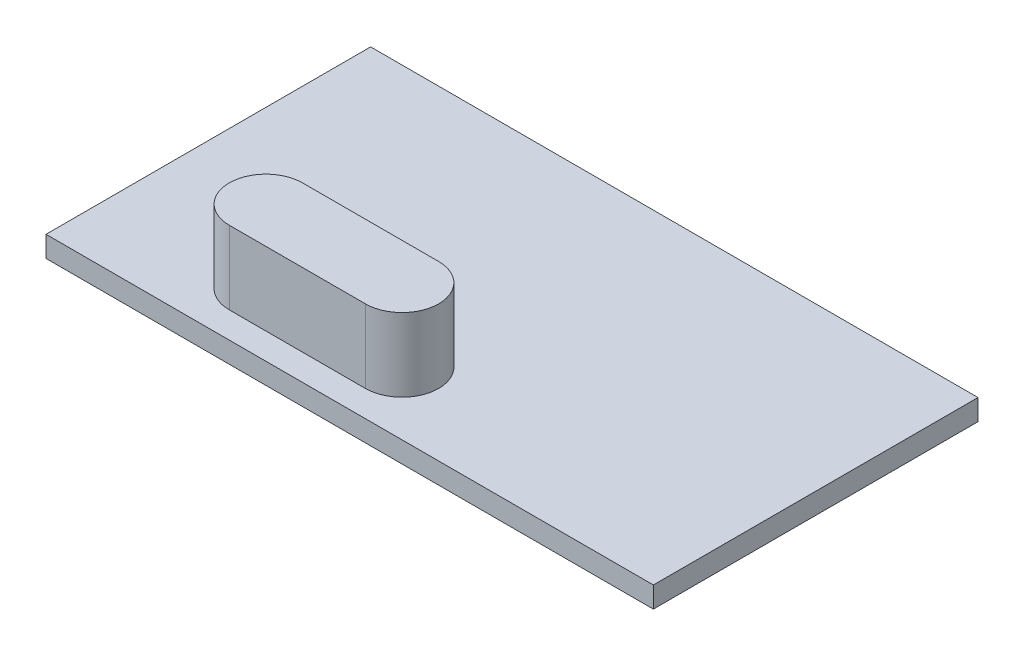
ISO-10303-21;
HEADER;
FILE_DESCRIPTION(('STEP AP214'),'2;1');
FILE_NAME('part.step','',(''),(''),'','','');
FILE_SCHEMA(('AUTOMOTIVE_DESIGN { 1 0 10303 214 1 1 1 1 }'));
ENDSEC;
DATA;
#1=APPLICATION_CONTEXT('core data for automotive mechanical design processes');
#2=APPLICATION_PROTOCOL_DEFINITION('international standard','automotive_design',2000,#1);
#3=PRODUCT_CONTEXT('',#1,'mechanical');
#4=PRODUCT('Part','Part','',(#3));
#5=PRODUCT_RELATED_PRODUCT_CATEGORY('part','',(#4));
#6=PRODUCT_DEFINITION_FORMATION('','',#4);
#7=PRODUCT_DEFINITION_CONTEXT('part definition',#1,'design');
#8=PRODUCT_DEFINITION('design','',#6,#7);
#9=PRODUCT_DEFINITION_SHAPE('','',#8);
#10=(LENGTH_UNIT() NAMED_UNIT(*) SI_UNIT(.MILLI.,.METRE.));
#11=(NAMED_UNIT(*) PLANE_ANGLE_UNIT() SI_UNIT($,.RADIAN.));
#12=(NAMED_UNIT(*) SI_UNIT($,.STERADIAN.) SOLID_ANGLE_UNIT());
#13=UNCERTAINTY_MEASURE_WITH_UNIT(LENGTH_MEASURE(1.E-05),#10,'distance_accuracy_value','');
#14=(GEOMETRIC_REPRESENTATION_CONTEXT(3) GLOBAL_UNCERTAINTY_ASSIGNED_CONTEXT((#13)) GLOBAL_UNIT_ASSIGNED_CONTEXT((#10,
#11,#12)) REPRESENTATION_CONTEXT('',''));
#15=CARTESIAN_POINT('',(0.,0.,0.));
#16=DIRECTION('',(0.,0.,1.));
#17=DIRECTION('',(1.,0.,0.));
#18=AXIS2_PLACEMENT_3D('',#15,#16,#17);
#19=CARTESIAN_POINT('',(0.,0.,0.));
#20=DIRECTION('',(0.,-1.,0.));
#21=DIRECTION('',(0.,0.,-1.));
#22=AXIS2_PLACEMENT_3D('',#19,#20,#21);
#23=PLANE('',#22);
#24=DIRECTION('',(0.,0.,-1.));
#25=VECTOR('',#24,1.);
#26=CARTESIAN_POINT('',(14.5,0.,7.75));
#27=LINE('',#26,#25);
#28=CARTESIAN_POINT('',(14.5,0.,7.75));
#29=VERTEX_POINT('',#28);
#30=CARTESIAN_POINT('',(14.5,0.,-7.75));
#31=VERTEX_POINT('',#30);
#32=EDGE_CURVE('E204',#29,#31,#27,.T.);
#33=ORIENTED_EDGE('',*,*,#32,.F.);
#34=DIRECTION('',(1.,0.,0.));
#35=VECTOR('',#34,1.);
#36=CARTESIAN_POINT('',(-14.5,0.,7.75));
#37=LINE('',#36,#35);
#38=CARTESIAN_POINT('',(-14.5,0.,7.75));
#39=VERTEX_POINT('',#38);
#40=EDGE_CURVE('E210',#39,#29,#37,.T.);
#41=ORIENTED_EDGE('',*,*,#40,.F.);
#42=DIRECTION('',(0.,0.,1.));
#43=VECTOR('',#42,1.);
#44=CARTESIAN_POINT('',(-14.5,0.,7.75));
#45=LINE('',#44,#43);
#46=CARTESIAN_POINT('',(-14.5,0.,-7.75));
#47=VERTEX_POINT('',#46);
#48=EDGE_CURVE('E226',#47,#39,#45,.T.);
#49=ORIENTED_EDGE('',*,*,#48,.F.);
#50=DIRECTION('',(-1.,0.,0.));
#51=VECTOR('',#50,1.);
#52=CARTESIAN_POINT('',(-14.5,0.,-7.75));
#53=LINE('',#52,#51);
#54=EDGE_CURVE('E223',#31,#47,#53,.T.);
#55=ORIENTED_EDGE('',*,*,#54,.F.);
#56=EDGE_LOOP('',(#33,#41,#49,#55));
#57=FACE_BOUND('',#56,.T.);
#58=DIRECTION('',(1.,0.,0.));
#59=VECTOR('',#58,1.);
#60=CARTESIAN_POINT('',(-14.3,0.,-7.25));
#61=LINE('',#60,#59);
#62=CARTESIAN_POINT('',(-14.3,0.,-7.25));
#63=VERTEX_POINT('',#62);
#64=CARTESIAN_POINT('',(-9.3,0.,-7.25));
#65=VERTEX_POINT('',#64);
#66=EDGE_CURVE('E407',#63,#65,#61,.T.);
#67=ORIENTED_EDGE('',*,*,#66,.F.);
#68=DIRECTION('',(0.,0.,-1.));
#69=VECTOR('',#68,1.);
#70=CARTESIAN_POINT('',(-14.3,0.,2.75));
#71=LINE('',#70,#69);
#72=CARTESIAN_POINT('',(-14.3,0.,2.75));
#73=VERTEX_POINT('',#72);
#74=EDGE_CURVE('E154',#73,#63,#71,.T.);
#75=ORIENTED_EDGE('',*,*,#74,.F.);
#76=DIRECTION('',(-1.,0.,0.));
#77=VECTOR('',#76,1.);
#78=CARTESIAN_POINT('',(-14.3,0.,2.75));
#79=LINE('',#78,#77);
#80=CARTESIAN_POINT('',(-9.3,0.,2.75));
#81=VERTEX_POINT('',#80);
#82=EDGE_CURVE('E150',#81,#73,#79,.T.);
#83=ORIENTED_EDGE('',*,*,#82,.F.);
#84=DIRECTION('',(0.,0.,1.));
#85=VECTOR('',#84,1.);
#86=CARTESIAN_POINT('',(-9.3,0.,2.75));
#87=LINE('',#86,#85);
#88=EDGE_CURVE('E403',#65,#81,#87,.T.);
#89=ORIENTED_EDGE('',*,*,#88,.F.);
#90=EDGE_LOOP('',(#67,#75,#83,#89));
#91=FACE_BOUND('',#90,.T.);
#92=ADVANCED_FACE('F39',(#57,#91),#23,.T.);
#93=CARTESIAN_POINT('',(0.,1.,0.));
#94=DIRECTION('',(0.,-1.,0.));
#95=DIRECTION('',(0.,0.,-1.));
#96=AXIS2_PLACEMENT_3D('',#93,#94,#95);
#97=PLANE('',#96);
#98=DIRECTION('',(0.,0.,-1.));
#99=VECTOR('',#98,1.);
#100=CARTESIAN_POINT('',(14.5,1.,7.75));
#101=LINE('',#100,#99);
#102=CARTESIAN_POINT('',(14.5,1.,7.75));
#103=VERTEX_POINT('',#102);
#104=CARTESIAN_POINT('',(14.5,1.,-7.75));
#105=VERTEX_POINT('',#104);
#106=EDGE_CURVE('E205',#103,#105,#101,.T.);
#107=ORIENTED_EDGE('',*,*,#106,.T.);
#108=DIRECTION('',(-1.,0.,0.));
#109=VECTOR('',#108,1.);
#110=CARTESIAN_POINT('',(-14.5,1.,-7.75));
#111=LINE('',#110,#109);
#112=CARTESIAN_POINT('',(-14.5,1.,-7.75));
#113=VERTEX_POINT('',#112);
#114=EDGE_CURVE('E209',#105,#113,#111,.T.);
#115=ORIENTED_EDGE('',*,*,#114,.T.);
#116=DIRECTION('',(0.,0.,1.));
#117=VECTOR('',#116,1.);
#118=CARTESIAN_POINT('',(-14.5,1.,7.75));
#119=LINE('',#118,#117);
#120=CARTESIAN_POINT('',(-14.5,1.,7.75));
#121=VERTEX_POINT('',#120);
#122=EDGE_CURVE('E213',#113,#121,#119,.T.);
#123=ORIENTED_EDGE('',*,*,#122,.T.);
#124=DIRECTION('',(1.,0.,0.));
#125=VECTOR('',#124,1.);
#126=CARTESIAN_POINT('',(-14.5,1.,7.75));
#127=LINE('',#126,#125);
#128=EDGE_CURVE('E216',#121,#103,#127,.T.);
#129=ORIENTED_EDGE('',*,*,#128,.T.);
#130=EDGE_LOOP('',(#107,#115,#123,#129));
#131=FACE_BOUND('',#130,.T.);
#132=CARTESIAN_POINT('',(-7.,1.,4.75));
#133=DIRECTION('',(0.,1.,0.));
#134=DIRECTION('',(0.,0.,1.));
#135=AXIS2_PLACEMENT_3D('',#132,#133,#134);
#136=CIRCLE('',#135,1.75);
#137=CARTESIAN_POINT('',(-7.,1.,3.));
#138=VERTEX_POINT('',#137);
#139=CARTESIAN_POINT('',(-7.,1.,6.5));
#140=VERTEX_POINT('',#139);
#141=EDGE_CURVE('E157',#138,#140,#136,.T.);
#142=ORIENTED_EDGE('',*,*,#141,.F.);
#143=DIRECTION('',(-1.,0.,0.));
#144=VECTOR('',#143,1.);
#145=CARTESIAN_POINT('',(-7.,1.,3.));
#146=LINE('',#145,#144);
#147=CARTESIAN_POINT('',(-0.500000000000005,1.,3.));
#148=VERTEX_POINT('',#147);
#149=EDGE_CURVE('E171',#148,#138,#146,.T.);
#150=ORIENTED_EDGE('',*,*,#149,.F.);
#151=CARTESIAN_POINT('',(-0.500000000000005,1.,4.75));
#152=DIRECTION('',(0.,1.,0.));
#153=DIRECTION('',(0.,0.,1.));
#154=AXIS2_PLACEMENT_3D('',#151,#152,#153);
#155=CIRCLE('',#154,1.75);
#156=CARTESIAN_POINT('',(-0.500000000000005,1.,6.5));
#157=VERTEX_POINT('',#156);
#158=EDGE_CURVE('E183',#157,#148,#155,.T.);
#159=ORIENTED_EDGE('',*,*,#158,.F.);
#160=DIRECTION('',(1.,0.,0.));
#161=VECTOR('',#160,1.);
#162=CARTESIAN_POINT('',(-7.,1.,6.5));
#163=LINE('',#162,#161);
#164=EDGE_CURVE('E63',#140,#157,#163,.T.);
#165=ORIENTED_EDGE('',*,*,#164,.F.);
#166=EDGE_LOOP('',(#142,#150,#159,#165));
#167=FACE_BOUND('',#166,.T.);
#168=ADVANCED_FACE('F258',(#131,#167),#97,.F.);
#169=CARTESIAN_POINT('',(14.5,1.,7.75));
#170=DIRECTION('',(-1.,0.,0.));
#171=DIRECTION('',(0.,0.,1.));
#172=AXIS2_PLACEMENT_3D('',#169,#170,#171);
#173=PLANE('',#172);
#174=ORIENTED_EDGE('',*,*,#32,.T.);
#175=DIRECTION('',(0.,-1.,0.));
#176=VECTOR('',#175,1.);
#177=CARTESIAN_POINT('',(14.5,1.,-7.75));
#178=LINE('',#177,#176);
#179=EDGE_CURVE('E11',#105,#31,#178,.T.);
#180=ORIENTED_EDGE('',*,*,#179,.F.);
#181=ORIENTED_EDGE('',*,*,#106,.F.);
#182=DIRECTION('',(0.,-1.,0.));
#183=VECTOR('',#182,1.);
#184=CARTESIAN_POINT('',(14.5,1.,7.75));
#185=LINE('',#184,#183);
#186=EDGE_CURVE('E219',#103,#29,#185,.T.);
#187=ORIENTED_EDGE('',*,*,#186,.T.);
#188=EDGE_LOOP('',(#174,#180,#181,#187));
#189=FACE_BOUND('',#188,.T.);
#190=ADVANCED_FACE('F41',(#189),#173,.F.);
#191=CARTESIAN_POINT('',(-14.5,1.,-7.75));
#192=DIRECTION('',(0.,0.,1.));
#193=DIRECTION('',(1.,0.,0.));
#194=AXIS2_PLACEMENT_3D('',#191,#192,#193);
#195=PLANE('',#194);
#196=ORIENTED_EDGE('',*,*,#54,.T.);
#197=DIRECTION('',(0.,-1.,0.));
#198=VECTOR('',#197,1.);
#199=CARTESIAN_POINT('',(-14.5,1.,-7.75));
#200=LINE('',#199,#198);
#201=EDGE_CURVE('E48',#113,#47,#200,.T.);
#202=ORIENTED_EDGE('',*,*,#201,.F.);
#203=ORIENTED_EDGE('',*,*,#114,.F.);
#204=ORIENTED_EDGE('',*,*,#179,.T.);
#205=EDGE_LOOP('',(#196,#202,#203,#204));
#206=FACE_BOUND('',#205,.T.);
#207=ADVANCED_FACE('F259',(#206),#195,.F.);
#208=CARTESIAN_POINT('',(-14.5,1.,7.75));
#209=DIRECTION('',(1.,0.,0.));
#210=DIRECTION('',(0.,0.,-1.));
#211=AXIS2_PLACEMENT_3D('',#208,#209,#210);
#212=PLANE('',#211);
#213=ORIENTED_EDGE('',*,*,#48,.T.);
#214=DIRECTION('',(0.,-1.,0.));
#215=VECTOR('',#214,1.);
#216=CARTESIAN_POINT('',(-14.5,1.,7.75));
#217=LINE('',#216,#215);
#218=EDGE_CURVE('E234',#121,#39,#217,.T.);
#219=ORIENTED_EDGE('',*,*,#218,.F.);
#220=ORIENTED_EDGE('',*,*,#122,.F.);
#221=ORIENTED_EDGE('',*,*,#201,.T.);
#222=EDGE_LOOP('',(#213,#219,#220,#221));
#223=FACE_BOUND('',#222,.T.);
#224=ADVANCED_FACE('F243',(#223),#212,.F.);
#225=CARTESIAN_POINT('',(-14.5,1.,7.75));
#226=DIRECTION('',(0.,0.,-1.));
#227=DIRECTION('',(-1.,0.,0.));
#228=AXIS2_PLACEMENT_3D('',#225,#226,#227);
#229=PLANE('',#228);
#230=ORIENTED_EDGE('',*,*,#40,.T.);
#231=ORIENTED_EDGE('',*,*,#186,.F.);
#232=ORIENTED_EDGE('',*,*,#128,.F.);
#233=ORIENTED_EDGE('',*,*,#218,.T.);
#234=EDGE_LOOP('',(#230,#231,#232,#233));
#235=FACE_BOUND('',#234,.T.);
#236=ADVANCED_FACE('F252',(#235),#229,.F.);
#237=CARTESIAN_POINT('',(-7.,4.5,4.75));
#238=DIRECTION('',(0.,-1.,0.));
#239=DIRECTION('',(0.,0.,-1.));
#240=AXIS2_PLACEMENT_3D('',#237,#238,#239);
#241=CYLINDRICAL_SURFACE('',#240,1.75);
#242=ORIENTED_EDGE('',*,*,#141,.T.);
#243=DIRECTION('',(0.,-1.,0.));
#244=VECTOR('',#243,1.);
#245=CARTESIAN_POINT('',(-7.,4.5,6.5));
#246=LINE('',#245,#244);
#247=CARTESIAN_POINT('',(-7.,4.5,6.5));
#248=VERTEX_POINT('',#247);
#249=EDGE_CURVE('E201',#248,#140,#246,.T.);
#250=ORIENTED_EDGE('',*,*,#249,.F.);
#251=CARTESIAN_POINT('',(-7.,4.5,4.75));
#252=DIRECTION('',(0.,1.,0.));
#253=DIRECTION('',(0.,0.,1.));
#254=AXIS2_PLACEMENT_3D('',#251,#252,#253);
#255=CIRCLE('',#254,1.75);
#256=CARTESIAN_POINT('',(-7.,4.5,3.));
#257=VERTEX_POINT('',#256);
#258=EDGE_CURVE('E166',#257,#248,#255,.T.);
#259=ORIENTED_EDGE('',*,*,#258,.F.);
#260=DIRECTION('',(0.,-1.,0.));
#261=VECTOR('',#260,1.);
#262=CARTESIAN_POINT('',(-7.,4.5,3.));
#263=LINE('',#262,#261);
#264=EDGE_CURVE('E179',#257,#138,#263,.T.);
#265=ORIENTED_EDGE('',*,*,#264,.T.);
#266=EDGE_LOOP('',(#242,#250,#259,#265));
#267=FACE_BOUND('',#266,.T.);
#268=ADVANCED_FACE('F275',(#267),#241,.T.);
#269=CARTESIAN_POINT('',(-7.,4.5,6.5));
#270=DIRECTION('',(0.,0.,-1.));
#271=DIRECTION('',(-1.,0.,0.));
#272=AXIS2_PLACEMENT_3D('',#269,#270,#271);
#273=PLANE('',#272);
#274=ORIENTED_EDGE('',*,*,#164,.T.);
#275=DIRECTION('',(0.,-1.,0.));
#276=VECTOR('',#275,1.);
#277=CARTESIAN_POINT('',(-0.500000000000005,4.5,6.5));
#278=LINE('',#277,#276);
#279=CARTESIAN_POINT('',(-0.500000000000005,4.5,6.5));
#280=VERTEX_POINT('',#279);
#281=EDGE_CURVE('E197',#280,#157,#278,.T.);
#282=ORIENTED_EDGE('',*,*,#281,.F.);
#283=DIRECTION('',(1.,0.,0.));
#284=VECTOR('',#283,1.);
#285=CARTESIAN_POINT('',(-7.,4.5,6.5));
#286=LINE('',#285,#284);
#287=EDGE_CURVE('E170',#248,#280,#286,.T.);
#288=ORIENTED_EDGE('',*,*,#287,.F.);
#289=ORIENTED_EDGE('',*,*,#249,.T.);
#290=EDGE_LOOP('',(#274,#282,#288,#289));
#291=FACE_BOUND('',#290,.T.);
#292=ADVANCED_FACE('F279',(#291),#273,.F.);
#293=CARTESIAN_POINT('',(-0.500000000000005,4.5,4.75));
#294=DIRECTION('',(0.,-1.,0.));
#295=DIRECTION('',(0.,0.,-1.));
#296=AXIS2_PLACEMENT_3D('',#293,#294,#295);
#297=CYLINDRICAL_SURFACE('',#296,1.75);
#298=ORIENTED_EDGE('',*,*,#158,.T.);
#299=DIRECTION('',(0.,-1.,0.));
#300=VECTOR('',#299,1.);
#301=CARTESIAN_POINT('',(-0.500000000000005,4.5,3.));
#302=LINE('',#301,#300);
#303=CARTESIAN_POINT('',(-0.500000000000005,4.5,3.));
#304=VERTEX_POINT('',#303);
#305=EDGE_CURVE('E193',#304,#148,#302,.T.);
#306=ORIENTED_EDGE('',*,*,#305,.F.);
#307=CARTESIAN_POINT('',(-0.500000000000005,4.5,4.75));
#308=DIRECTION('',(0.,1.,0.));
#309=DIRECTION('',(0.,0.,1.));
#310=AXIS2_PLACEMENT_3D('',#307,#308,#309);
#311=CIRCLE('',#310,1.75);
#312=EDGE_CURVE('E174',#280,#304,#311,.T.);
#313=ORIENTED_EDGE('',*,*,#312,.F.);
#314=ORIENTED_EDGE('',*,*,#281,.T.);
#315=EDGE_LOOP('',(#298,#306,#313,#314));
#316=FACE_BOUND('',#315,.T.);
#317=ADVANCED_FACE('F284',(#316),#297,.T.);
#318=CARTESIAN_POINT('',(-7.,4.5,3.));
#319=DIRECTION('',(0.,0.,1.));
#320=DIRECTION('',(1.,0.,0.));
#321=AXIS2_PLACEMENT_3D('',#318,#319,#320);
#322=PLANE('',#321);
#323=ORIENTED_EDGE('',*,*,#149,.T.);
#324=ORIENTED_EDGE('',*,*,#264,.F.);
#325=DIRECTION('',(-1.,0.,0.));
#326=VECTOR('',#325,1.);
#327=CARTESIAN_POINT('',(-7.,4.5,3.));
#328=LINE('',#327,#326);
#329=EDGE_CURVE('E177',#304,#257,#328,.T.);
#330=ORIENTED_EDGE('',*,*,#329,.F.);
#331=ORIENTED_EDGE('',*,*,#305,.T.);
#332=EDGE_LOOP('',(#323,#324,#330,#331));
#333=FACE_BOUND('',#332,.T.);
#334=ADVANCED_FACE('F290',(#333),#322,.F.);
#335=CARTESIAN_POINT('',(-7.,4.5,4.75));
#336=DIRECTION('',(0.,1.,0.));
#337=DIRECTION('',(0.,0.,1.));
#338=AXIS2_PLACEMENT_3D('',#335,#336,#337);
#339=PLANE('',#338);
#340=ORIENTED_EDGE('',*,*,#258,.T.);
#341=ORIENTED_EDGE('',*,*,#287,.T.);
#342=ORIENTED_EDGE('',*,*,#312,.T.);
#343=ORIENTED_EDGE('',*,*,#329,.T.);
#344=EDGE_LOOP('',(#340,#341,#342,#343));
#345=FACE_BOUND('',#344,.T.);
#346=ADVANCED_FACE('F294',(#345),#339,.T.);
#347=CARTESIAN_POINT('',(-14.3,-3.,2.75));
#348=DIRECTION('',(1.,0.,0.));
#349=DIRECTION('',(0.,0.,-1.));
#350=AXIS2_PLACEMENT_3D('',#347,#348,#349);
#351=PLANE('',#350);
#352=ORIENTED_EDGE('',*,*,#74,.T.);
#353=DIRECTION('',(0.,1.,0.));
#354=VECTOR('',#353,1.);
#355=CARTESIAN_POINT('',(-14.3,-3.,-7.25));
#356=LINE('',#355,#354);
#357=CARTESIAN_POINT('',(-14.3,-3.,-7.25));
#358=VERTEX_POINT('',#357);
#359=EDGE_CURVE('E133',#358,#63,#356,.T.);
#360=ORIENTED_EDGE('',*,*,#359,.F.);
#361=DIRECTION('',(0.,0.,-1.));
#362=VECTOR('',#361,1.);
#363=CARTESIAN_POINT('',(-14.3,-3.,2.75));
#364=LINE('',#363,#362);
#365=CARTESIAN_POINT('',(-14.3,-3.,2.75));
#366=VERTEX_POINT('',#365);
#367=EDGE_CURVE('E141',#366,#358,#364,.T.);
#368=ORIENTED_EDGE('',*,*,#367,.F.);
#369=DIRECTION('',(0.,1.,0.));
#370=VECTOR('',#369,1.);
#371=CARTESIAN_POINT('',(-14.3,-3.,2.75));
#372=LINE('',#371,#370);
#373=EDGE_CURVE('E400',#366,#73,#372,.T.);
#374=ORIENTED_EDGE('',*,*,#373,.T.);
#375=EDGE_LOOP('',(#352,#360,#368,#374));
#376=FACE_BOUND('',#375,.T.);
#377=ADVANCED_FACE('F152',(#376),#351,.F.);
#378=CARTESIAN_POINT('',(-14.3,-3.,-7.25));
#379=DIRECTION('',(0.,0.,1.));
#380=DIRECTION('',(1.,0.,0.));
#381=AXIS2_PLACEMENT_3D('',#378,#379,#380);
#382=PLANE('',#381);
#383=ORIENTED_EDGE('',*,*,#66,.T.);
#384=DIRECTION('',(0.,1.,0.));
#385=VECTOR('',#384,1.);
#386=CARTESIAN_POINT('',(-9.3,-3.,-7.25));
#387=LINE('',#386,#385);
#388=CARTESIAN_POINT('',(-9.3,-3.,-7.25));
#389=VERTEX_POINT('',#388);
#390=EDGE_CURVE('E136',#389,#65,#387,.T.);
#391=ORIENTED_EDGE('',*,*,#390,.F.);
#392=DIRECTION('',(1.,0.,0.));
#393=VECTOR('',#392,1.);
#394=CARTESIAN_POINT('',(-14.3,-3.,-7.25));
#395=LINE('',#394,#393);
#396=EDGE_CURVE('E129',#358,#389,#395,.T.);
#397=ORIENTED_EDGE('',*,*,#396,.F.);
#398=ORIENTED_EDGE('',*,*,#359,.T.);
#399=EDGE_LOOP('',(#383,#391,#397,#398));
#400=FACE_BOUND('',#399,.T.);
#401=ADVANCED_FACE('F131',(#400),#382,.F.);
#402=CARTESIAN_POINT('',(-9.3,-3.,2.75));
#403=DIRECTION('',(-1.,0.,0.));
#404=DIRECTION('',(0.,0.,1.));
#405=AXIS2_PLACEMENT_3D('',#402,#403,#404);
#406=PLANE('',#405);
#407=ORIENTED_EDGE('',*,*,#88,.T.);
#408=DIRECTION('',(0.,1.,0.));
#409=VECTOR('',#408,1.);
#410=CARTESIAN_POINT('',(-9.3,-3.,2.75));
#411=LINE('',#410,#409);
#412=CARTESIAN_POINT('',(-9.3,-3.,2.75));
#413=VERTEX_POINT('',#412);
#414=EDGE_CURVE('E55',#413,#81,#411,.T.);
#415=ORIENTED_EDGE('',*,*,#414,.F.);
#416=DIRECTION('',(0.,0.,1.));
#417=VECTOR('',#416,1.);
#418=CARTESIAN_POINT('',(-9.3,-3.,2.75));
#419=LINE('',#418,#417);
#420=EDGE_CURVE('E140',#389,#413,#419,.T.);
#421=ORIENTED_EDGE('',*,*,#420,.F.);
#422=ORIENTED_EDGE('',*,*,#390,.T.);
#423=EDGE_LOOP('',(#407,#415,#421,#422));
#424=FACE_BOUND('',#423,.T.);
#425=ADVANCED_FACE('F303',(#424),#406,.F.);
#426=CARTESIAN_POINT('',(-14.3,-3.,2.75));
#427=DIRECTION('',(0.,0.,-1.));
#428=DIRECTION('',(-1.,0.,0.));
#429=AXIS2_PLACEMENT_3D('',#426,#427,#428);
#430=PLANE('',#429);
#431=ORIENTED_EDGE('',*,*,#82,.T.);
#432=ORIENTED_EDGE('',*,*,#373,.F.);
#433=DIRECTION('',(-1.,0.,0.));
#434=VECTOR('',#433,1.);
#435=CARTESIAN_POINT('',(-14.3,-3.,2.75));
#436=LINE('',#435,#434);
#437=EDGE_CURVE('E145',#413,#366,#436,.T.);
#438=ORIENTED_EDGE('',*,*,#437,.F.);
#439=ORIENTED_EDGE('',*,*,#414,.T.);
#440=EDGE_LOOP('',(#431,#432,#438,#439));
#441=FACE_BOUND('',#440,.T.);
#442=ADVANCED_FACE('F306',(#441),#430,.F.);
#443=CARTESIAN_POINT('',(0.,-3.,0.));
#444=DIRECTION('',(0.,-1.,0.));
#445=DIRECTION('',(0.,0.,-1.));
#446=AXIS2_PLACEMENT_3D('',#443,#444,#445);
#447=PLANE('',#446);
#448=ORIENTED_EDGE('',*,*,#367,.T.);
#449=ORIENTED_EDGE('',*,*,#396,.T.);
#450=ORIENTED_EDGE('',*,*,#420,.T.);
#451=ORIENTED_EDGE('',*,*,#437,.T.);
#452=EDGE_LOOP('',(#448,#449,#450,#451));
#453=FACE_BOUND('',#452,.T.);
#454=ADVANCED_FACE('F144',(#453),#447,.T.);
#455=CLOSED_SHELL('',(#92,#168,#190,#207,#224,#236,#268,#292,#317,#334,#346,#377,#401,#425,#442,#454));
#456=MANIFOLD_SOLID_BREP('B2',#455);
#457=ADVANCED_BREP_SHAPE_REPRESENTATION('',(#18,#456),#14);
#458=SHAPE_DEFINITION_REPRESENTATION(#9,#457);
ENDSEC;
END-ISO-10303-21;
